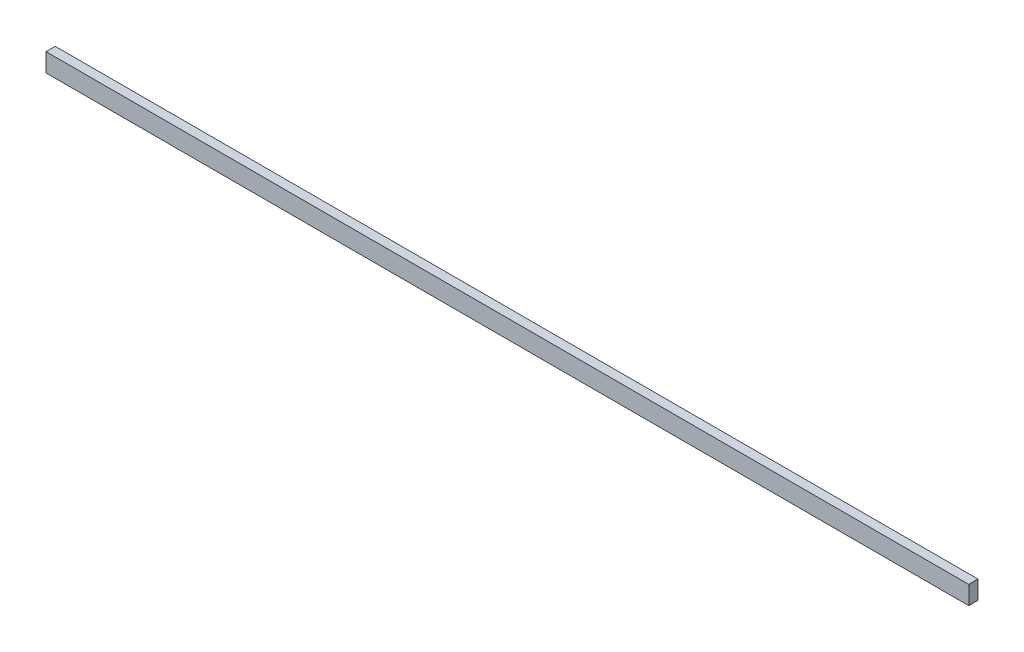
ISO-10303-21;
HEADER;
FILE_DESCRIPTION(('STEP AP214'),'2;1');
FILE_NAME('part.step','',(''),(''),'','','');
FILE_SCHEMA(('AUTOMOTIVE_DESIGN { 1 0 10303 214 1 1 1 1 }'));
ENDSEC;
DATA;
#1=APPLICATION_CONTEXT('core data for automotive mechanical design processes');
#2=APPLICATION_PROTOCOL_DEFINITION('international standard','automotive_design',2000,#1);
#3=PRODUCT_CONTEXT('',#1,'mechanical');
#4=PRODUCT('Part','Part','',(#3));
#5=PRODUCT_RELATED_PRODUCT_CATEGORY('part','',(#4));
#6=PRODUCT_DEFINITION_FORMATION('','',#4);
#7=PRODUCT_DEFINITION_CONTEXT('part definition',#1,'design');
#8=PRODUCT_DEFINITION('design','',#6,#7);
#9=PRODUCT_DEFINITION_SHAPE('','',#8);
#10=(LENGTH_UNIT() NAMED_UNIT(*) SI_UNIT(.MILLI.,.METRE.));
#11=(NAMED_UNIT(*) PLANE_ANGLE_UNIT() SI_UNIT($,.RADIAN.));
#12=(NAMED_UNIT(*) SI_UNIT($,.STERADIAN.) SOLID_ANGLE_UNIT());
#13=UNCERTAINTY_MEASURE_WITH_UNIT(LENGTH_MEASURE(1.E-05),#10,'distance_accuracy_value','');
#14=(GEOMETRIC_REPRESENTATION_CONTEXT(3) GLOBAL_UNCERTAINTY_ASSIGNED_CONTEXT((#13)) GLOBAL_UNIT_ASSIGNED_CONTEXT((#10,
#11,#12)) REPRESENTATION_CONTEXT('',''));
#15=CARTESIAN_POINT('',(0.,0.,0.));
#16=DIRECTION('',(0.,0.,1.));
#17=DIRECTION('',(1.,0.,0.));
#18=AXIS2_PLACEMENT_3D('',#15,#16,#17);
#19=CARTESIAN_POINT('',(0.,-25.4,25.4));
#20=DIRECTION('',(1.,0.,0.));
#21=DIRECTION('',(0.,0.,-1.));
#22=AXIS2_PLACEMENT_3D('',#19,#20,#21);
#23=PLANE('',#22);
#24=DIRECTION('',(0.,-1.,0.));
#25=VECTOR('',#24,1.);
#26=CARTESIAN_POINT('',(0.,-25.4,0.));
#27=LINE('',#26,#25);
#28=CARTESIAN_POINT('',(0.,25.4,0.));
#29=VERTEX_POINT('',#28);
#30=CARTESIAN_POINT('',(0.,-25.4,0.));
#31=VERTEX_POINT('',#30);
#32=EDGE_CURVE('E103',#29,#31,#27,.T.);
#33=ORIENTED_EDGE('',*,*,#32,.T.);
#34=DIRECTION('',(0.,0.,-1.));
#35=VECTOR('',#34,1.);
#36=CARTESIAN_POINT('',(0.,-25.4,25.4));
#37=LINE('',#36,#35);
#38=CARTESIAN_POINT('',(0.,-25.4,25.4));
#39=VERTEX_POINT('',#38);
#40=EDGE_CURVE('E11',#39,#31,#37,.T.);
#41=ORIENTED_EDGE('',*,*,#40,.F.);
#42=DIRECTION('',(0.,-1.,0.));
#43=VECTOR('',#42,1.);
#44=CARTESIAN_POINT('',(0.,-25.4,25.4));
#45=LINE('',#44,#43);
#46=CARTESIAN_POINT('',(0.,25.4,25.4));
#47=VERTEX_POINT('',#46);
#48=EDGE_CURVE('E91',#47,#39,#45,.T.);
#49=ORIENTED_EDGE('',*,*,#48,.F.);
#50=DIRECTION('',(0.,0.,-1.));
#51=VECTOR('',#50,1.);
#52=CARTESIAN_POINT('',(0.,25.4,25.4));
#53=LINE('',#52,#51);
#54=EDGE_CURVE('E99',#47,#29,#53,.T.);
#55=ORIENTED_EDGE('',*,*,#54,.T.);
#56=EDGE_LOOP('',(#33,#41,#49,#55));
#57=FACE_BOUND('',#56,.T.);
#58=ADVANCED_FACE('F40',(#57),#23,.F.);
#59=CARTESIAN_POINT('',(0.,-25.4,25.4));
#60=DIRECTION('',(0.,1.,0.));
#61=DIRECTION('',(0.,0.,1.));
#62=AXIS2_PLACEMENT_3D('',#59,#60,#61);
#63=PLANE('',#62);
#64=DIRECTION('',(1.,0.,0.));
#65=VECTOR('',#64,1.);
#66=CARTESIAN_POINT('',(0.,-25.4,0.));
#67=LINE('',#66,#65);
#68=CARTESIAN_POINT('',(2540.,-25.4,0.));
#69=VERTEX_POINT('',#68);
#70=EDGE_CURVE('E95',#31,#69,#67,.T.);
#71=ORIENTED_EDGE('',*,*,#70,.T.);
#72=DIRECTION('',(0.,0.,-1.));
#73=VECTOR('',#72,1.);
#74=CARTESIAN_POINT('',(2540.,-25.4,25.4));
#75=LINE('',#74,#73);
#76=CARTESIAN_POINT('',(2540.,-25.4,25.4));
#77=VERTEX_POINT('',#76);
#78=EDGE_CURVE('E48',#77,#69,#75,.T.);
#79=ORIENTED_EDGE('',*,*,#78,.F.);
#80=DIRECTION('',(1.,0.,0.));
#81=VECTOR('',#80,1.);
#82=CARTESIAN_POINT('',(0.,-25.4,25.4));
#83=LINE('',#82,#81);
#84=EDGE_CURVE('E86',#39,#77,#83,.T.);
#85=ORIENTED_EDGE('',*,*,#84,.F.);
#86=ORIENTED_EDGE('',*,*,#40,.T.);
#87=EDGE_LOOP('',(#71,#79,#85,#86));
#88=FACE_BOUND('',#87,.T.);
#89=ADVANCED_FACE('F94',(#88),#63,.F.);
#90=CARTESIAN_POINT('',(2540.,-25.4,25.4));
#91=DIRECTION('',(-1.,0.,0.));
#92=DIRECTION('',(0.,0.,1.));
#93=AXIS2_PLACEMENT_3D('',#90,#91,#92);
#94=PLANE('',#93);
#95=DIRECTION('',(0.,1.,0.));
#96=VECTOR('',#95,1.);
#97=CARTESIAN_POINT('',(2540.,-25.4,0.));
#98=LINE('',#97,#96);
#99=CARTESIAN_POINT('',(2540.,25.4,0.));
#100=VERTEX_POINT('',#99);
#101=EDGE_CURVE('E73',#69,#100,#98,.T.);
#102=ORIENTED_EDGE('',*,*,#101,.T.);
#103=DIRECTION('',(0.,0.,-1.));
#104=VECTOR('',#103,1.);
#105=CARTESIAN_POINT('',(2540.,25.4,25.4));
#106=LINE('',#105,#104);
#107=CARTESIAN_POINT('',(2540.,25.4,25.4));
#108=VERTEX_POINT('',#107);
#109=EDGE_CURVE('E96',#108,#100,#106,.T.);
#110=ORIENTED_EDGE('',*,*,#109,.F.);
#111=DIRECTION('',(0.,1.,0.));
#112=VECTOR('',#111,1.);
#113=CARTESIAN_POINT('',(2540.,-25.4,25.4));
#114=LINE('',#113,#112);
#115=EDGE_CURVE('E89',#77,#108,#114,.T.);
#116=ORIENTED_EDGE('',*,*,#115,.F.);
#117=ORIENTED_EDGE('',*,*,#78,.T.);
#118=EDGE_LOOP('',(#102,#110,#116,#117));
#119=FACE_BOUND('',#118,.T.);
#120=ADVANCED_FACE('F97',(#119),#94,.F.);
#121=CARTESIAN_POINT('',(0.,25.4,25.4));
#122=DIRECTION('',(0.,-1.,0.));
#123=DIRECTION('',(0.,0.,-1.));
#124=AXIS2_PLACEMENT_3D('',#121,#122,#123);
#125=PLANE('',#124);
#126=DIRECTION('',(-1.,0.,0.));
#127=VECTOR('',#126,1.);
#128=CARTESIAN_POINT('',(0.,25.4,0.));
#129=LINE('',#128,#127);
#130=EDGE_CURVE('E79',#100,#29,#129,.T.);
#131=ORIENTED_EDGE('',*,*,#130,.T.);
#132=ORIENTED_EDGE('',*,*,#54,.F.);
#133=DIRECTION('',(-1.,0.,0.));
#134=VECTOR('',#133,1.);
#135=CARTESIAN_POINT('',(0.,25.4,25.4));
#136=LINE('',#135,#134);
#137=EDGE_CURVE('E56',#108,#47,#136,.T.);
#138=ORIENTED_EDGE('',*,*,#137,.F.);
#139=ORIENTED_EDGE('',*,*,#109,.T.);
#140=EDGE_LOOP('',(#131,#132,#138,#139));
#141=FACE_BOUND('',#140,.T.);
#142=ADVANCED_FACE('F110',(#141),#125,.F.);
#143=CARTESIAN_POINT('',(0.,25.4,25.4));
#144=DIRECTION('',(0.,0.,-1.));
#145=DIRECTION('',(-1.,0.,0.));
#146=AXIS2_PLACEMENT_3D('',#143,#144,#145);
#147=PLANE('',#146);
#148=ORIENTED_EDGE('',*,*,#48,.T.);
#149=ORIENTED_EDGE('',*,*,#84,.T.);
#150=ORIENTED_EDGE('',*,*,#115,.T.);
#151=ORIENTED_EDGE('',*,*,#137,.T.);
#152=EDGE_LOOP('',(#148,#149,#150,#151));
#153=FACE_BOUND('',#152,.T.);
#154=ADVANCED_FACE('F87',(#153),#147,.F.);
#155=CARTESIAN_POINT('',(0.,25.4,0.));
#156=DIRECTION('',(0.,0.,-1.));
#157=DIRECTION('',(-1.,0.,0.));
#158=AXIS2_PLACEMENT_3D('',#155,#156,#157);
#159=PLANE('',#158);
#160=ORIENTED_EDGE('',*,*,#32,.F.);
#161=ORIENTED_EDGE('',*,*,#130,.F.);
#162=ORIENTED_EDGE('',*,*,#101,.F.);
#163=ORIENTED_EDGE('',*,*,#70,.F.);
#164=EDGE_LOOP('',(#160,#161,#162,#163));
#165=FACE_BOUND('',#164,.T.);
#166=ADVANCED_FACE('F113',(#165),#159,.T.);
#167=CLOSED_SHELL('',(#58,#89,#120,#142,#154,#166));
#168=MANIFOLD_SOLID_BREP('B2',#167);
#169=ADVANCED_BREP_SHAPE_REPRESENTATION('',(#18,#168),#14);
#170=SHAPE_DEFINITION_REPRESENTATION(#9,#169);
ENDSEC;
END-ISO-10303-21;
